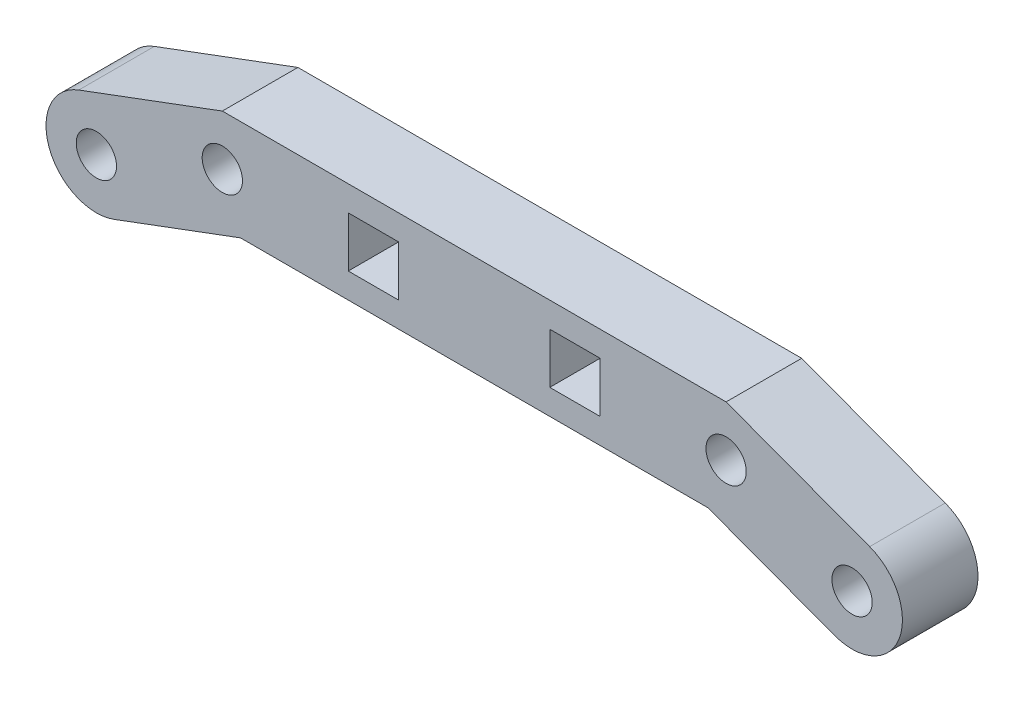
ISO-10303-21;
HEADER;
FILE_DESCRIPTION(('STEP AP214'),'2;1');
FILE_NAME('part.step','',(''),(''),'','','');
FILE_SCHEMA(('AUTOMOTIVE_DESIGN { 1 0 10303 214 1 1 1 1 }'));
ENDSEC;
DATA;
#1=APPLICATION_CONTEXT('core data for automotive mechanical design processes');
#2=APPLICATION_PROTOCOL_DEFINITION('international standard','automotive_design',2000,#1);
#3=PRODUCT_CONTEXT('',#1,'mechanical');
#4=PRODUCT('Part','Part','',(#3));
#5=PRODUCT_RELATED_PRODUCT_CATEGORY('part','',(#4));
#6=PRODUCT_DEFINITION_FORMATION('','',#4);
#7=PRODUCT_DEFINITION_CONTEXT('part definition',#1,'design');
#8=PRODUCT_DEFINITION('design','',#6,#7);
#9=PRODUCT_DEFINITION_SHAPE('','',#8);
#10=(LENGTH_UNIT() NAMED_UNIT(*) SI_UNIT(.MILLI.,.METRE.));
#11=(NAMED_UNIT(*) PLANE_ANGLE_UNIT() SI_UNIT($,.RADIAN.));
#12=(NAMED_UNIT(*) SI_UNIT($,.STERADIAN.) SOLID_ANGLE_UNIT());
#13=UNCERTAINTY_MEASURE_WITH_UNIT(LENGTH_MEASURE(1.E-05),#10,'distance_accuracy_value','');
#14=(GEOMETRIC_REPRESENTATION_CONTEXT(3) GLOBAL_UNCERTAINTY_ASSIGNED_CONTEXT((#13)) GLOBAL_UNIT_ASSIGNED_CONTEXT((#10,
#11,#12)) REPRESENTATION_CONTEXT('',''));
#15=CARTESIAN_POINT('',(0.,0.,0.));
#16=DIRECTION('',(0.,0.,1.));
#17=DIRECTION('',(1.,0.,0.));
#18=AXIS2_PLACEMENT_3D('',#15,#16,#17);
#19=CARTESIAN_POINT('',(-75.,-20.,15.));
#20=DIRECTION('',(0.,0.,1.));
#21=DIRECTION('',(1.,0.,0.));
#22=AXIS2_PLACEMENT_3D('',#19,#20,#21);
#23=PLANE('',#22);
#24=CARTESIAN_POINT('',(-75.,-20.,15.));
#25=DIRECTION('',(0.,0.,1.));
#26=DIRECTION('',(1.,0.,0.));
#27=AXIS2_PLACEMENT_3D('',#24,#25,#26);
#28=CIRCLE('',#27,4.00000000000001);
#29=CARTESIAN_POINT('',(-71.,-20.,15.));
#30=VERTEX_POINT('',#29);
#31=EDGE_CURVE('E175',#30,#30,#28,.T.);
#32=ORIENTED_EDGE('',*,*,#31,.F.);
#33=EDGE_LOOP('',(#32));
#34=FACE_BOUND('',#33,.T.);
#35=CARTESIAN_POINT('',(-50.,-10.,15.));
#36=DIRECTION('',(0.,0.,1.));
#37=DIRECTION('',(1.,0.,0.));
#38=AXIS2_PLACEMENT_3D('',#35,#36,#37);
#39=CIRCLE('',#38,4.);
#40=CARTESIAN_POINT('',(-46.,-10.,15.));
#41=VERTEX_POINT('',#40);
#42=EDGE_CURVE('E191',#41,#41,#39,.T.);
#43=ORIENTED_EDGE('',*,*,#42,.F.);
#44=EDGE_LOOP('',(#43));
#45=FACE_BOUND('',#44,.T.);
#46=CARTESIAN_POINT('',(-75.,-20.,15.));
#47=DIRECTION('',(0.,0.,1.));
#48=DIRECTION('',(1.,0.,0.));
#49=AXIS2_PLACEMENT_3D('',#46,#47,#48);
#50=CIRCLE('',#49,10.);
#51=CARTESIAN_POINT('',(-78.4953780783397,-10.6307774020753,15.));
#52=VERTEX_POINT('',#51);
#53=CARTESIAN_POINT('',(-71.5046219216603,-29.3692225979247,15.));
#54=VERTEX_POINT('',#53);
#55=EDGE_CURVE('E228',#52,#54,#50,.T.);
#56=ORIENTED_EDGE('',*,*,#55,.T.);
#57=DIRECTION('',(0.936922259792466,0.349537807833973,0.));
#58=VECTOR('',#57,1.);
#59=CARTESIAN_POINT('',(-71.5046219216603,-29.3692225979247,15.));
#60=LINE('',#59,#58);
#61=CARTESIAN_POINT('',(-46.3907915656726,-20.,15.));
#62=VERTEX_POINT('',#61);
#63=EDGE_CURVE('E231',#54,#62,#60,.T.);
#64=ORIENTED_EDGE('',*,*,#63,.T.);
#65=DIRECTION('',(1.,0.,0.));
#66=VECTOR('',#65,1.);
#67=CARTESIAN_POINT('',(-46.3907915656726,-20.,15.));
#68=LINE('',#67,#66);
#69=CARTESIAN_POINT('',(46.3907915656726,-20.,15.));
#70=VERTEX_POINT('',#69);
#71=EDGE_CURVE('E234',#62,#70,#68,.T.);
#72=ORIENTED_EDGE('',*,*,#71,.T.);
#73=DIRECTION('',(0.936922259792466,-0.349537807833973,0.));
#74=VECTOR('',#73,1.);
#75=CARTESIAN_POINT('',(46.3907915656726,-20.,15.));
#76=LINE('',#75,#74);
#77=CARTESIAN_POINT('',(71.5046219216603,-29.3692225979246,15.));
#78=VERTEX_POINT('',#77);
#79=EDGE_CURVE('E236',#70,#78,#76,.T.);
#80=ORIENTED_EDGE('',*,*,#79,.T.);
#81=CARTESIAN_POINT('',(75.,-20.,15.));
#82=DIRECTION('',(0.,0.,1.));
#83=DIRECTION('',(-1.,0.,0.));
#84=AXIS2_PLACEMENT_3D('',#81,#82,#83);
#85=CIRCLE('',#84,10.);
#86=CARTESIAN_POINT('',(78.4953780783397,-10.6307774020753,15.));
#87=VERTEX_POINT('',#86);
#88=EDGE_CURVE('E238',#78,#87,#85,.T.);
#89=ORIENTED_EDGE('',*,*,#88,.T.);
#90=DIRECTION('',(-0.936922259792466,0.349537807833972,0.));
#91=VECTOR('',#90,1.);
#92=CARTESIAN_POINT('',(78.4953780783397,-10.6307774020753,15.));
#93=LINE('',#92,#91);
#94=CARTESIAN_POINT('',(50.,0.,15.));
#95=VERTEX_POINT('',#94);
#96=EDGE_CURVE('E240',#87,#95,#93,.T.);
#97=ORIENTED_EDGE('',*,*,#96,.T.);
#98=DIRECTION('',(-1.,0.,0.));
#99=VECTOR('',#98,1.);
#100=CARTESIAN_POINT('',(50.,0.,15.));
#101=LINE('',#100,#99);
#102=CARTESIAN_POINT('',(-50.,0.,15.));
#103=VERTEX_POINT('',#102);
#104=EDGE_CURVE('E242',#95,#103,#101,.T.);
#105=ORIENTED_EDGE('',*,*,#104,.T.);
#106=DIRECTION('',(-0.936922259792466,-0.349537807833973,0.));
#107=VECTOR('',#106,1.);
#108=CARTESIAN_POINT('',(-50.,0.,15.));
#109=LINE('',#108,#107);
#110=EDGE_CURVE('E244',#103,#52,#109,.T.);
#111=ORIENTED_EDGE('',*,*,#110,.T.);
#112=EDGE_LOOP('',(#56,#64,#72,#80,#89,#97,#105,#111));
#113=FACE_BOUND('',#112,.T.);
#114=DIRECTION('',(1.,0.,0.));
#115=VECTOR('',#114,1.);
#116=CARTESIAN_POINT('',(25.,-15.,15.));
#117=LINE('',#116,#115);
#118=CARTESIAN_POINT('',(15.,-15.,15.));
#119=VERTEX_POINT('',#118);
#120=CARTESIAN_POINT('',(25.,-15.,15.));
#121=VERTEX_POINT('',#120);
#122=EDGE_CURVE('E199',#119,#121,#117,.T.);
#123=ORIENTED_EDGE('',*,*,#122,.F.);
#124=DIRECTION('',(0.,-1.,0.));
#125=VECTOR('',#124,1.);
#126=CARTESIAN_POINT('',(15.,-5.,15.));
#127=LINE('',#126,#125);
#128=CARTESIAN_POINT('',(15.,-5.,15.));
#129=VERTEX_POINT('',#128);
#130=EDGE_CURVE('E197',#129,#119,#127,.T.);
#131=ORIENTED_EDGE('',*,*,#130,.F.);
#132=DIRECTION('',(-1.,0.,0.));
#133=VECTOR('',#132,1.);
#134=CARTESIAN_POINT('',(25.,-5.,15.));
#135=LINE('',#134,#133);
#136=CARTESIAN_POINT('',(25.,-5.,15.));
#137=VERTEX_POINT('',#136);
#138=EDGE_CURVE('E205',#137,#129,#135,.T.);
#139=ORIENTED_EDGE('',*,*,#138,.F.);
#140=DIRECTION('',(0.,1.,0.));
#141=VECTOR('',#140,1.);
#142=CARTESIAN_POINT('',(25.,-5.,15.));
#143=LINE('',#142,#141);
#144=EDGE_CURVE('E202',#121,#137,#143,.T.);
#145=ORIENTED_EDGE('',*,*,#144,.F.);
#146=EDGE_LOOP('',(#123,#131,#139,#145));
#147=FACE_BOUND('',#146,.T.);
#148=CARTESIAN_POINT('',(50.,-10.,15.));
#149=DIRECTION('',(0.,0.,1.));
#150=DIRECTION('',(-1.,0.,0.));
#151=AXIS2_PLACEMENT_3D('',#148,#149,#150);
#152=CIRCLE('',#151,4.);
#153=CARTESIAN_POINT('',(46.,-10.,15.));
#154=VERTEX_POINT('',#153);
#155=EDGE_CURVE('E185',#154,#154,#152,.T.);
#156=ORIENTED_EDGE('',*,*,#155,.F.);
#157=EDGE_LOOP('',(#156));
#158=FACE_BOUND('',#157,.T.);
#159=DIRECTION('',(1.,0.,0.));
#160=VECTOR('',#159,1.);
#161=CARTESIAN_POINT('',(-25.,-15.,15.));
#162=LINE('',#161,#160);
#163=CARTESIAN_POINT('',(-25.,-15.,15.));
#164=VERTEX_POINT('',#163);
#165=CARTESIAN_POINT('',(-15.,-15.,15.));
#166=VERTEX_POINT('',#165);
#167=EDGE_CURVE('E154',#164,#166,#162,.T.);
#168=ORIENTED_EDGE('',*,*,#167,.F.);
#169=DIRECTION('',(0.,-1.,0.));
#170=VECTOR('',#169,1.);
#171=CARTESIAN_POINT('',(-25.,-5.00000000000001,15.));
#172=LINE('',#171,#170);
#173=CARTESIAN_POINT('',(-25.,-5.00000000000001,15.));
#174=VERTEX_POINT('',#173);
#175=EDGE_CURVE('E146',#174,#164,#172,.T.);
#176=ORIENTED_EDGE('',*,*,#175,.F.);
#177=DIRECTION('',(-1.,0.,0.));
#178=VECTOR('',#177,1.);
#179=CARTESIAN_POINT('',(-25.,-5.00000000000001,15.));
#180=LINE('',#179,#178);
#181=CARTESIAN_POINT('',(-15.,-5.00000000000001,15.));
#182=VERTEX_POINT('',#181);
#183=EDGE_CURVE('E169',#182,#174,#180,.T.);
#184=ORIENTED_EDGE('',*,*,#183,.F.);
#185=DIRECTION('',(0.,1.,0.));
#186=VECTOR('',#185,1.);
#187=CARTESIAN_POINT('',(-15.,-5.00000000000001,15.));
#188=LINE('',#187,#186);
#189=EDGE_CURVE('E167',#166,#182,#188,.T.);
#190=ORIENTED_EDGE('',*,*,#189,.F.);
#191=EDGE_LOOP('',(#168,#176,#184,#190));
#192=FACE_BOUND('',#191,.T.);
#193=CARTESIAN_POINT('',(75.,-20.,15.));
#194=DIRECTION('',(0.,0.,1.));
#195=DIRECTION('',(-1.,0.,0.));
#196=AXIS2_PLACEMENT_3D('',#193,#194,#195);
#197=CIRCLE('',#196,4.00000000000001);
#198=CARTESIAN_POINT('',(71.,-20.,15.));
#199=VERTEX_POINT('',#198);
#200=EDGE_CURVE('E468',#199,#199,#197,.T.);
#201=ORIENTED_EDGE('',*,*,#200,.F.);
#202=EDGE_LOOP('',(#201));
#203=FACE_BOUND('',#202,.T.);
#204=ADVANCED_FACE('F33',(#34,#45,#113,#147,#158,#192,#203),#23,.T.);
#205=CARTESIAN_POINT('',(-75.,-20.,0.));
#206=DIRECTION('',(0.,0.,1.));
#207=DIRECTION('',(1.,0.,0.));
#208=AXIS2_PLACEMENT_3D('',#205,#206,#207);
#209=PLANE('',#208);
#210=CARTESIAN_POINT('',(50.,-10.,0.));
#211=DIRECTION('',(0.,0.,1.));
#212=DIRECTION('',(-1.,0.,0.));
#213=AXIS2_PLACEMENT_3D('',#210,#211,#212);
#214=CIRCLE('',#213,4.);
#215=CARTESIAN_POINT('',(46.,-10.,0.));
#216=VERTEX_POINT('',#215);
#217=EDGE_CURVE('E162',#216,#216,#214,.T.);
#218=ORIENTED_EDGE('',*,*,#217,.T.);
#219=EDGE_LOOP('',(#218));
#220=FACE_BOUND('',#219,.T.);
#221=CARTESIAN_POINT('',(-50.,-10.,0.));
#222=DIRECTION('',(0.,0.,1.));
#223=DIRECTION('',(1.,0.,0.));
#224=AXIS2_PLACEMENT_3D('',#221,#222,#223);
#225=CIRCLE('',#224,4.);
#226=CARTESIAN_POINT('',(-46.,-10.,0.));
#227=VERTEX_POINT('',#226);
#228=EDGE_CURVE('E188',#227,#227,#225,.T.);
#229=ORIENTED_EDGE('',*,*,#228,.T.);
#230=EDGE_LOOP('',(#229));
#231=FACE_BOUND('',#230,.T.);
#232=DIRECTION('',(0.,-1.,0.));
#233=VECTOR('',#232,1.);
#234=CARTESIAN_POINT('',(15.,-5.,0.));
#235=LINE('',#234,#233);
#236=CARTESIAN_POINT('',(15.,-5.,0.));
#237=VERTEX_POINT('',#236);
#238=CARTESIAN_POINT('',(15.,-15.,0.));
#239=VERTEX_POINT('',#238);
#240=EDGE_CURVE('E194',#237,#239,#235,.T.);
#241=ORIENTED_EDGE('',*,*,#240,.T.);
#242=DIRECTION('',(1.,0.,0.));
#243=VECTOR('',#242,1.);
#244=CARTESIAN_POINT('',(25.,-15.,0.));
#245=LINE('',#244,#243);
#246=CARTESIAN_POINT('',(25.,-15.,0.));
#247=VERTEX_POINT('',#246);
#248=EDGE_CURVE('E210',#239,#247,#245,.T.);
#249=ORIENTED_EDGE('',*,*,#248,.T.);
#250=DIRECTION('',(0.,1.,0.));
#251=VECTOR('',#250,1.);
#252=CARTESIAN_POINT('',(25.,-5.,0.));
#253=LINE('',#252,#251);
#254=CARTESIAN_POINT('',(25.,-5.,0.));
#255=VERTEX_POINT('',#254);
#256=EDGE_CURVE('E213',#247,#255,#253,.T.);
#257=ORIENTED_EDGE('',*,*,#256,.T.);
#258=DIRECTION('',(-1.,0.,0.));
#259=VECTOR('',#258,1.);
#260=CARTESIAN_POINT('',(25.,-5.,0.));
#261=LINE('',#260,#259);
#262=EDGE_CURVE('E200',#255,#237,#261,.T.);
#263=ORIENTED_EDGE('',*,*,#262,.T.);
#264=EDGE_LOOP('',(#241,#249,#257,#263));
#265=FACE_BOUND('',#264,.T.);
#266=CARTESIAN_POINT('',(-75.,-20.,0.));
#267=DIRECTION('',(0.,0.,1.));
#268=DIRECTION('',(1.,0.,0.));
#269=AXIS2_PLACEMENT_3D('',#266,#267,#268);
#270=CIRCLE('',#269,10.);
#271=CARTESIAN_POINT('',(-78.4953780783397,-10.6307774020753,0.));
#272=VERTEX_POINT('',#271);
#273=CARTESIAN_POINT('',(-71.5046219216603,-29.3692225979247,0.));
#274=VERTEX_POINT('',#273);
#275=EDGE_CURVE('E227',#272,#274,#270,.T.);
#276=ORIENTED_EDGE('',*,*,#275,.F.);
#277=DIRECTION('',(-0.936922259792466,-0.349537807833973,0.));
#278=VECTOR('',#277,1.);
#279=CARTESIAN_POINT('',(-50.,0.,0.));
#280=LINE('',#279,#278);
#281=CARTESIAN_POINT('',(-50.,0.,0.));
#282=VERTEX_POINT('',#281);
#283=EDGE_CURVE('E232',#282,#272,#280,.T.);
#284=ORIENTED_EDGE('',*,*,#283,.F.);
#285=DIRECTION('',(-1.,0.,0.));
#286=VECTOR('',#285,1.);
#287=CARTESIAN_POINT('',(0.,0.,0.));
#288=LINE('',#287,#286);
#289=CARTESIAN_POINT('',(50.,0.,0.));
#290=VERTEX_POINT('',#289);
#291=EDGE_CURVE('E260',#290,#282,#288,.T.);
#292=ORIENTED_EDGE('',*,*,#291,.F.);
#293=DIRECTION('',(-0.936922259792466,0.349537807833972,0.));
#294=VECTOR('',#293,1.);
#295=CARTESIAN_POINT('',(78.4953780783397,-10.6307774020753,0.));
#296=LINE('',#295,#294);
#297=CARTESIAN_POINT('',(78.4953780783397,-10.6307774020753,0.));
#298=VERTEX_POINT('',#297);
#299=EDGE_CURVE('E257',#298,#290,#296,.T.);
#300=ORIENTED_EDGE('',*,*,#299,.F.);
#301=CARTESIAN_POINT('',(75.,-20.,0.));
#302=DIRECTION('',(0.,0.,1.));
#303=DIRECTION('',(-1.,0.,0.));
#304=AXIS2_PLACEMENT_3D('',#301,#302,#303);
#305=CIRCLE('',#304,10.);
#306=CARTESIAN_POINT('',(71.5046219216603,-29.3692225979246,0.));
#307=VERTEX_POINT('',#306);
#308=EDGE_CURVE('E255',#307,#298,#305,.T.);
#309=ORIENTED_EDGE('',*,*,#308,.F.);
#310=DIRECTION('',(0.936922259792466,-0.349537807833973,0.));
#311=VECTOR('',#310,1.);
#312=CARTESIAN_POINT('',(46.3907915656726,-20.,0.));
#313=LINE('',#312,#311);
#314=CARTESIAN_POINT('',(46.3907915656726,-20.,0.));
#315=VERTEX_POINT('',#314);
#316=EDGE_CURVE('E253',#315,#307,#313,.T.);
#317=ORIENTED_EDGE('',*,*,#316,.F.);
#318=DIRECTION('',(1.,0.,0.));
#319=VECTOR('',#318,1.);
#320=CARTESIAN_POINT('',(-46.3907915656726,-20.,0.));
#321=LINE('',#320,#319);
#322=CARTESIAN_POINT('',(-46.3907915656726,-20.,0.));
#323=VERTEX_POINT('',#322);
#324=EDGE_CURVE('E251',#323,#315,#321,.T.);
#325=ORIENTED_EDGE('',*,*,#324,.F.);
#326=DIRECTION('',(0.936922259792466,0.349537807833973,0.));
#327=VECTOR('',#326,1.);
#328=CARTESIAN_POINT('',(-71.5046219216603,-29.3692225979247,0.));
#329=LINE('',#328,#327);
#330=EDGE_CURVE('E249',#274,#323,#329,.T.);
#331=ORIENTED_EDGE('',*,*,#330,.F.);
#332=EDGE_LOOP('',(#276,#284,#292,#300,#309,#317,#325,#331));
#333=FACE_BOUND('',#332,.T.);
#334=DIRECTION('',(0.,-1.,0.));
#335=VECTOR('',#334,1.);
#336=CARTESIAN_POINT('',(-25.,-5.00000000000001,0.));
#337=LINE('',#336,#335);
#338=CARTESIAN_POINT('',(-25.,-5.00000000000001,0.));
#339=VERTEX_POINT('',#338);
#340=CARTESIAN_POINT('',(-25.,-15.,0.));
#341=VERTEX_POINT('',#340);
#342=EDGE_CURVE('E56',#339,#341,#337,.T.);
#343=ORIENTED_EDGE('',*,*,#342,.T.);
#344=DIRECTION('',(1.,0.,0.));
#345=VECTOR('',#344,1.);
#346=CARTESIAN_POINT('',(-25.,-15.,0.));
#347=LINE('',#346,#345);
#348=CARTESIAN_POINT('',(-15.,-15.,0.));
#349=VERTEX_POINT('',#348);
#350=EDGE_CURVE('E161',#341,#349,#347,.T.);
#351=ORIENTED_EDGE('',*,*,#350,.T.);
#352=DIRECTION('',(0.,1.,0.));
#353=VECTOR('',#352,1.);
#354=CARTESIAN_POINT('',(-15.,-5.00000000000001,0.));
#355=LINE('',#354,#353);
#356=CARTESIAN_POINT('',(-15.,-5.00000000000001,0.));
#357=VERTEX_POINT('',#356);
#358=EDGE_CURVE('E177',#349,#357,#355,.T.);
#359=ORIENTED_EDGE('',*,*,#358,.T.);
#360=DIRECTION('',(-1.,0.,0.));
#361=VECTOR('',#360,1.);
#362=CARTESIAN_POINT('',(-25.,-5.00000000000001,0.));
#363=LINE('',#362,#361);
#364=EDGE_CURVE('E155',#357,#339,#363,.T.);
#365=ORIENTED_EDGE('',*,*,#364,.T.);
#366=EDGE_LOOP('',(#343,#351,#359,#365));
#367=FACE_BOUND('',#366,.T.);
#368=CARTESIAN_POINT('',(-75.,-20.,0.));
#369=DIRECTION('',(0.,0.,1.));
#370=DIRECTION('',(1.,0.,0.));
#371=AXIS2_PLACEMENT_3D('',#368,#369,#370);
#372=CIRCLE('',#371,4.00000000000001);
#373=CARTESIAN_POINT('',(-71.,-20.,0.));
#374=VERTEX_POINT('',#373);
#375=EDGE_CURVE('E474',#374,#374,#372,.T.);
#376=ORIENTED_EDGE('',*,*,#375,.T.);
#377=EDGE_LOOP('',(#376));
#378=FACE_BOUND('',#377,.T.);
#379=CARTESIAN_POINT('',(75.,-20.,0.));
#380=DIRECTION('',(0.,0.,1.));
#381=DIRECTION('',(-1.,0.,0.));
#382=AXIS2_PLACEMENT_3D('',#379,#380,#381);
#383=CIRCLE('',#382,4.00000000000001);
#384=CARTESIAN_POINT('',(71.,-20.,0.));
#385=VERTEX_POINT('',#384);
#386=EDGE_CURVE('E471',#385,#385,#383,.T.);
#387=ORIENTED_EDGE('',*,*,#386,.T.);
#388=EDGE_LOOP('',(#387));
#389=FACE_BOUND('',#388,.T.);
#390=ADVANCED_FACE('F290',(#220,#231,#265,#333,#367,#378,#389),#209,.F.);
#391=CARTESIAN_POINT('',(-75.,-20.,15.));
#392=DIRECTION('',(0.,0.,-1.));
#393=DIRECTION('',(-1.,0.,0.));
#394=AXIS2_PLACEMENT_3D('',#391,#392,#393);
#395=CYLINDRICAL_SURFACE('',#394,10.);
#396=ORIENTED_EDGE('',*,*,#275,.T.);
#397=DIRECTION('',(0.,0.,-1.));
#398=VECTOR('',#397,1.);
#399=CARTESIAN_POINT('',(-71.5046219216603,-29.3692225979247,15.));
#400=LINE('',#399,#398);
#401=EDGE_CURVE('E11',#54,#274,#400,.T.);
#402=ORIENTED_EDGE('',*,*,#401,.F.);
#403=ORIENTED_EDGE('',*,*,#55,.F.);
#404=DIRECTION('',(0.,0.,-1.));
#405=VECTOR('',#404,1.);
#406=CARTESIAN_POINT('',(-78.4953780783397,-10.6307774020753,15.));
#407=LINE('',#406,#405);
#408=EDGE_CURVE('E246',#52,#272,#407,.T.);
#409=ORIENTED_EDGE('',*,*,#408,.T.);
#410=EDGE_LOOP('',(#396,#402,#403,#409));
#411=FACE_BOUND('',#410,.T.);
#412=ADVANCED_FACE('F35',(#411),#395,.T.);
#413=CARTESIAN_POINT('',(-71.5046219216603,-29.3692225979247,15.));
#414=DIRECTION('',(-0.349537807833973,0.936922259792466,0.));
#415=DIRECTION('',(-0.936922259792466,-0.349537807833973,0.));
#416=AXIS2_PLACEMENT_3D('',#413,#414,#415);
#417=PLANE('',#416);
#418=ORIENTED_EDGE('',*,*,#330,.T.);
#419=DIRECTION('',(0.,0.,-1.));
#420=VECTOR('',#419,1.);
#421=CARTESIAN_POINT('',(-46.3907915656726,-20.,15.));
#422=LINE('',#421,#420);
#423=EDGE_CURVE('E41',#62,#323,#422,.T.);
#424=ORIENTED_EDGE('',*,*,#423,.F.);
#425=ORIENTED_EDGE('',*,*,#63,.F.);
#426=ORIENTED_EDGE('',*,*,#401,.T.);
#427=EDGE_LOOP('',(#418,#424,#425,#426));
#428=FACE_BOUND('',#427,.T.);
#429=ADVANCED_FACE('F308',(#428),#417,.F.);
#430=CARTESIAN_POINT('',(-46.3907915656726,-20.,15.));
#431=DIRECTION('',(0.,1.,0.));
#432=DIRECTION('',(-1.,0.,0.));
#433=AXIS2_PLACEMENT_3D('',#430,#431,#432);
#434=PLANE('',#433);
#435=ORIENTED_EDGE('',*,*,#324,.T.);
#436=DIRECTION('',(0.,0.,-1.));
#437=VECTOR('',#436,1.);
#438=CARTESIAN_POINT('',(46.3907915656726,-20.,15.));
#439=LINE('',#438,#437);
#440=EDGE_CURVE('E277',#70,#315,#439,.T.);
#441=ORIENTED_EDGE('',*,*,#440,.F.);
#442=ORIENTED_EDGE('',*,*,#71,.F.);
#443=ORIENTED_EDGE('',*,*,#423,.T.);
#444=EDGE_LOOP('',(#435,#441,#442,#443));
#445=FACE_BOUND('',#444,.T.);
#446=ADVANCED_FACE('F284',(#445),#434,.F.);
#447=CARTESIAN_POINT('',(46.3907915656726,-20.,15.));
#448=DIRECTION('',(0.349537807833973,0.936922259792466,0.));
#449=DIRECTION('',(-0.936922259792466,0.349537807833973,0.));
#450=AXIS2_PLACEMENT_3D('',#447,#448,#449);
#451=PLANE('',#450);
#452=ORIENTED_EDGE('',*,*,#316,.T.);
#453=DIRECTION('',(0.,0.,-1.));
#454=VECTOR('',#453,1.);
#455=CARTESIAN_POINT('',(71.5046219216603,-29.3692225979246,15.));
#456=LINE('',#455,#454);
#457=EDGE_CURVE('E274',#78,#307,#456,.T.);
#458=ORIENTED_EDGE('',*,*,#457,.F.);
#459=ORIENTED_EDGE('',*,*,#79,.F.);
#460=ORIENTED_EDGE('',*,*,#440,.T.);
#461=EDGE_LOOP('',(#452,#458,#459,#460));
#462=FACE_BOUND('',#461,.T.);
#463=ADVANCED_FACE('F296',(#462),#451,.F.);
#464=CARTESIAN_POINT('',(75.,-20.,15.));
#465=DIRECTION('',(0.,0.,-1.));
#466=DIRECTION('',(-1.,0.,0.));
#467=AXIS2_PLACEMENT_3D('',#464,#465,#466);
#468=CYLINDRICAL_SURFACE('',#467,10.);
#469=ORIENTED_EDGE('',*,*,#308,.T.);
#470=DIRECTION('',(0.,0.,-1.));
#471=VECTOR('',#470,1.);
#472=CARTESIAN_POINT('',(78.4953780783397,-10.6307774020753,15.));
#473=LINE('',#472,#471);
#474=EDGE_CURVE('E271',#87,#298,#473,.T.);
#475=ORIENTED_EDGE('',*,*,#474,.F.);
#476=ORIENTED_EDGE('',*,*,#88,.F.);
#477=ORIENTED_EDGE('',*,*,#457,.T.);
#478=EDGE_LOOP('',(#469,#475,#476,#477));
#479=FACE_BOUND('',#478,.T.);
#480=ADVANCED_FACE('F300',(#479),#468,.T.);
#481=CARTESIAN_POINT('',(78.4953780783397,-10.6307774020753,15.));
#482=DIRECTION('',(-0.349537807833972,-0.936922259792466,0.));
#483=DIRECTION('',(0.936922259792466,-0.349537807833972,0.));
#484=AXIS2_PLACEMENT_3D('',#481,#482,#483);
#485=PLANE('',#484);
#486=ORIENTED_EDGE('',*,*,#299,.T.);
#487=DIRECTION('',(0.,0.,-1.));
#488=VECTOR('',#487,1.);
#489=CARTESIAN_POINT('',(50.,0.,15.));
#490=LINE('',#489,#488);
#491=EDGE_CURVE('E268',#95,#290,#490,.T.);
#492=ORIENTED_EDGE('',*,*,#491,.F.);
#493=ORIENTED_EDGE('',*,*,#96,.F.);
#494=ORIENTED_EDGE('',*,*,#474,.T.);
#495=EDGE_LOOP('',(#486,#492,#493,#494));
#496=FACE_BOUND('',#495,.T.);
#497=ADVANCED_FACE('F320',(#496),#485,.F.);
#498=CARTESIAN_POINT('',(0.,0.,15.));
#499=DIRECTION('',(0.,-1.,0.));
#500=DIRECTION('',(0.,0.,-1.));
#501=AXIS2_PLACEMENT_3D('',#498,#499,#500);
#502=PLANE('',#501);
#503=ORIENTED_EDGE('',*,*,#291,.T.);
#504=DIRECTION('',(0.,0.,-1.));
#505=VECTOR('',#504,1.);
#506=CARTESIAN_POINT('',(-50.,0.,15.));
#507=LINE('',#506,#505);
#508=EDGE_CURVE('E265',#103,#282,#507,.T.);
#509=ORIENTED_EDGE('',*,*,#508,.F.);
#510=ORIENTED_EDGE('',*,*,#104,.F.);
#511=ORIENTED_EDGE('',*,*,#491,.T.);
#512=EDGE_LOOP('',(#503,#509,#510,#511));
#513=FACE_BOUND('',#512,.T.);
#514=ADVANCED_FACE('F318',(#513),#502,.F.);
#515=CARTESIAN_POINT('',(-50.,0.,15.));
#516=DIRECTION('',(0.349537807833973,-0.936922259792466,0.));
#517=DIRECTION('',(0.936922259792466,0.349537807833973,0.));
#518=AXIS2_PLACEMENT_3D('',#515,#516,#517);
#519=PLANE('',#518);
#520=ORIENTED_EDGE('',*,*,#283,.T.);
#521=ORIENTED_EDGE('',*,*,#408,.F.);
#522=ORIENTED_EDGE('',*,*,#110,.F.);
#523=ORIENTED_EDGE('',*,*,#508,.T.);
#524=EDGE_LOOP('',(#520,#521,#522,#523));
#525=FACE_BOUND('',#524,.T.);
#526=ADVANCED_FACE('F313',(#525),#519,.F.);
#527=CARTESIAN_POINT('',(15.,-5.,15.));
#528=DIRECTION('',(1.,0.,0.));
#529=DIRECTION('',(0.,0.,-1.));
#530=AXIS2_PLACEMENT_3D('',#527,#528,#529);
#531=PLANE('',#530);
#532=ORIENTED_EDGE('',*,*,#240,.F.);
#533=DIRECTION('',(0.,0.,-1.));
#534=VECTOR('',#533,1.);
#535=CARTESIAN_POINT('',(15.,-5.,15.));
#536=LINE('',#535,#534);
#537=EDGE_CURVE('E207',#129,#237,#536,.T.);
#538=ORIENTED_EDGE('',*,*,#537,.F.);
#539=ORIENTED_EDGE('',*,*,#130,.T.);
#540=DIRECTION('',(0.,0.,-1.));
#541=VECTOR('',#540,1.);
#542=CARTESIAN_POINT('',(15.,-15.,15.));
#543=LINE('',#542,#541);
#544=EDGE_CURVE('E224',#119,#239,#543,.T.);
#545=ORIENTED_EDGE('',*,*,#544,.T.);
#546=EDGE_LOOP('',(#532,#538,#539,#545));
#547=FACE_BOUND('',#546,.T.);
#548=ADVANCED_FACE('F340',(#547),#531,.T.);
#549=CARTESIAN_POINT('',(25.,-15.,15.));
#550=DIRECTION('',(0.,1.,0.));
#551=DIRECTION('',(0.,0.,1.));
#552=AXIS2_PLACEMENT_3D('',#549,#550,#551);
#553=PLANE('',#552);
#554=ORIENTED_EDGE('',*,*,#248,.F.);
#555=ORIENTED_EDGE('',*,*,#544,.F.);
#556=ORIENTED_EDGE('',*,*,#122,.T.);
#557=DIRECTION('',(0.,0.,-1.));
#558=VECTOR('',#557,1.);
#559=CARTESIAN_POINT('',(25.,-15.,15.));
#560=LINE('',#559,#558);
#561=EDGE_CURVE('E222',#121,#247,#560,.T.);
#562=ORIENTED_EDGE('',*,*,#561,.T.);
#563=EDGE_LOOP('',(#554,#555,#556,#562));
#564=FACE_BOUND('',#563,.T.);
#565=ADVANCED_FACE('F347',(#564),#553,.T.);
#566=CARTESIAN_POINT('',(25.,-5.,15.));
#567=DIRECTION('',(-1.,0.,0.));
#568=DIRECTION('',(0.,0.,1.));
#569=AXIS2_PLACEMENT_3D('',#566,#567,#568);
#570=PLANE('',#569);
#571=ORIENTED_EDGE('',*,*,#256,.F.);
#572=ORIENTED_EDGE('',*,*,#561,.F.);
#573=ORIENTED_EDGE('',*,*,#144,.T.);
#574=DIRECTION('',(0.,0.,-1.));
#575=VECTOR('',#574,1.);
#576=CARTESIAN_POINT('',(25.,-5.,15.));
#577=LINE('',#576,#575);
#578=EDGE_CURVE('E220',#137,#255,#577,.T.);
#579=ORIENTED_EDGE('',*,*,#578,.T.);
#580=EDGE_LOOP('',(#571,#572,#573,#579));
#581=FACE_BOUND('',#580,.T.);
#582=ADVANCED_FACE('F352',(#581),#570,.T.);
#583=CARTESIAN_POINT('',(25.,-5.,15.));
#584=DIRECTION('',(0.,-1.,0.));
#585=DIRECTION('',(1.,0.,0.));
#586=AXIS2_PLACEMENT_3D('',#583,#584,#585);
#587=PLANE('',#586);
#588=ORIENTED_EDGE('',*,*,#262,.F.);
#589=ORIENTED_EDGE('',*,*,#578,.F.);
#590=ORIENTED_EDGE('',*,*,#138,.T.);
#591=ORIENTED_EDGE('',*,*,#537,.T.);
#592=EDGE_LOOP('',(#588,#589,#590,#591));
#593=FACE_BOUND('',#592,.T.);
#594=ADVANCED_FACE('F360',(#593),#587,.T.);
#595=CARTESIAN_POINT('',(-50.,-10.,15.));
#596=DIRECTION('',(0.,0.,-1.));
#597=DIRECTION('',(-1.,0.,0.));
#598=AXIS2_PLACEMENT_3D('',#595,#596,#597);
#599=CYLINDRICAL_SURFACE('',#598,4.);
#600=ORIENTED_EDGE('',*,*,#42,.T.);
#601=EDGE_LOOP('',(#600));
#602=FACE_BOUND('',#601,.T.);
#603=ORIENTED_EDGE('',*,*,#228,.F.);
#604=EDGE_LOOP('',(#603));
#605=FACE_BOUND('',#604,.T.);
#606=ADVANCED_FACE('F373',(#602,#605),#599,.F.);
#607=CARTESIAN_POINT('',(50.,-10.,15.));
#608=DIRECTION('',(0.,0.,-1.));
#609=DIRECTION('',(-1.,0.,0.));
#610=AXIS2_PLACEMENT_3D('',#607,#608,#609);
#611=CYLINDRICAL_SURFACE('',#610,4.);
#612=ORIENTED_EDGE('',*,*,#155,.T.);
#613=EDGE_LOOP('',(#612));
#614=FACE_BOUND('',#613,.T.);
#615=ORIENTED_EDGE('',*,*,#217,.F.);
#616=EDGE_LOOP('',(#615));
#617=FACE_BOUND('',#616,.T.);
#618=ADVANCED_FACE('F370',(#614,#617),#611,.F.);
#619=CARTESIAN_POINT('',(-25.,-5.00000000000001,15.));
#620=DIRECTION('',(1.,0.,0.));
#621=DIRECTION('',(0.,1.,0.));
#622=AXIS2_PLACEMENT_3D('',#619,#620,#621);
#623=PLANE('',#622);
#624=ORIENTED_EDGE('',*,*,#342,.F.);
#625=DIRECTION('',(0.,0.,-1.));
#626=VECTOR('',#625,1.);
#627=CARTESIAN_POINT('',(-25.,-5.00000000000001,15.));
#628=LINE('',#627,#626);
#629=EDGE_CURVE('E150',#174,#339,#628,.T.);
#630=ORIENTED_EDGE('',*,*,#629,.F.);
#631=ORIENTED_EDGE('',*,*,#175,.T.);
#632=DIRECTION('',(0.,0.,-1.));
#633=VECTOR('',#632,1.);
#634=CARTESIAN_POINT('',(-25.,-15.,15.));
#635=LINE('',#634,#633);
#636=EDGE_CURVE('E149',#164,#341,#635,.T.);
#637=ORIENTED_EDGE('',*,*,#636,.T.);
#638=EDGE_LOOP('',(#624,#630,#631,#637));
#639=FACE_BOUND('',#638,.T.);
#640=ADVANCED_FACE('F148',(#639),#623,.T.);
#641=CARTESIAN_POINT('',(-25.,-15.,15.));
#642=DIRECTION('',(0.,1.,0.));
#643=DIRECTION('',(-1.,0.,0.));
#644=AXIS2_PLACEMENT_3D('',#641,#642,#643);
#645=PLANE('',#644);
#646=ORIENTED_EDGE('',*,*,#350,.F.);
#647=ORIENTED_EDGE('',*,*,#636,.F.);
#648=ORIENTED_EDGE('',*,*,#167,.T.);
#649=DIRECTION('',(0.,0.,-1.));
#650=VECTOR('',#649,1.);
#651=CARTESIAN_POINT('',(-15.,-15.,15.));
#652=LINE('',#651,#650);
#653=EDGE_CURVE('E163',#166,#349,#652,.T.);
#654=ORIENTED_EDGE('',*,*,#653,.T.);
#655=EDGE_LOOP('',(#646,#647,#648,#654));
#656=FACE_BOUND('',#655,.T.);
#657=ADVANCED_FACE('F158',(#656),#645,.T.);
#658=CARTESIAN_POINT('',(-15.,-5.00000000000001,15.));
#659=DIRECTION('',(-1.,0.,0.));
#660=DIRECTION('',(0.,-1.,0.));
#661=AXIS2_PLACEMENT_3D('',#658,#659,#660);
#662=PLANE('',#661);
#663=ORIENTED_EDGE('',*,*,#358,.F.);
#664=ORIENTED_EDGE('',*,*,#653,.F.);
#665=ORIENTED_EDGE('',*,*,#189,.T.);
#666=DIRECTION('',(0.,0.,-1.));
#667=VECTOR('',#666,1.);
#668=CARTESIAN_POINT('',(-15.,-5.00000000000001,15.));
#669=LINE('',#668,#667);
#670=EDGE_CURVE('E48',#182,#357,#669,.T.);
#671=ORIENTED_EDGE('',*,*,#670,.T.);
#672=EDGE_LOOP('',(#663,#664,#665,#671));
#673=FACE_BOUND('',#672,.T.);
#674=ADVANCED_FACE('F423',(#673),#662,.T.);
#675=CARTESIAN_POINT('',(-25.,-5.00000000000001,15.));
#676=DIRECTION('',(0.,-1.,0.));
#677=DIRECTION('',(1.,0.,0.));
#678=AXIS2_PLACEMENT_3D('',#675,#676,#677);
#679=PLANE('',#678);
#680=ORIENTED_EDGE('',*,*,#364,.F.);
#681=ORIENTED_EDGE('',*,*,#670,.F.);
#682=ORIENTED_EDGE('',*,*,#183,.T.);
#683=ORIENTED_EDGE('',*,*,#629,.T.);
#684=EDGE_LOOP('',(#680,#681,#682,#683));
#685=FACE_BOUND('',#684,.T.);
#686=ADVANCED_FACE('F432',(#685),#679,.T.);
#687=CARTESIAN_POINT('',(-75.,-20.,15.));
#688=DIRECTION('',(0.,0.,-1.));
#689=DIRECTION('',(-1.,0.,0.));
#690=AXIS2_PLACEMENT_3D('',#687,#688,#689);
#691=CYLINDRICAL_SURFACE('',#690,4.00000000000001);
#692=ORIENTED_EDGE('',*,*,#31,.T.);
#693=EDGE_LOOP('',(#692));
#694=FACE_BOUND('',#693,.T.);
#695=ORIENTED_EDGE('',*,*,#375,.F.);
#696=EDGE_LOOP('',(#695));
#697=FACE_BOUND('',#696,.T.);
#698=ADVANCED_FACE('F442',(#694,#697),#691,.F.);
#699=CARTESIAN_POINT('',(75.,-20.,15.));
#700=DIRECTION('',(0.,0.,-1.));
#701=DIRECTION('',(-1.,0.,0.));
#702=AXIS2_PLACEMENT_3D('',#699,#700,#701);
#703=CYLINDRICAL_SURFACE('',#702,4.00000000000001);
#704=ORIENTED_EDGE('',*,*,#200,.T.);
#705=EDGE_LOOP('',(#704));
#706=FACE_BOUND('',#705,.T.);
#707=ORIENTED_EDGE('',*,*,#386,.F.);
#708=EDGE_LOOP('',(#707));
#709=FACE_BOUND('',#708,.T.);
#710=ADVANCED_FACE('F451',(#706,#709),#703,.F.);
#711=CLOSED_SHELL('',(#204,#390,#412,#429,#446,#463,#480,#497,#514,#526,#548,#565,#582,#594,
#606,#618,#640,#657,#674,#686,#698,#710));
#712=MANIFOLD_SOLID_BREP('B2',#711);
#713=ADVANCED_BREP_SHAPE_REPRESENTATION('',(#18,#712),#14);
#714=SHAPE_DEFINITION_REPRESENTATION(#9,#713);
ENDSEC;
END-ISO-10303-21;
